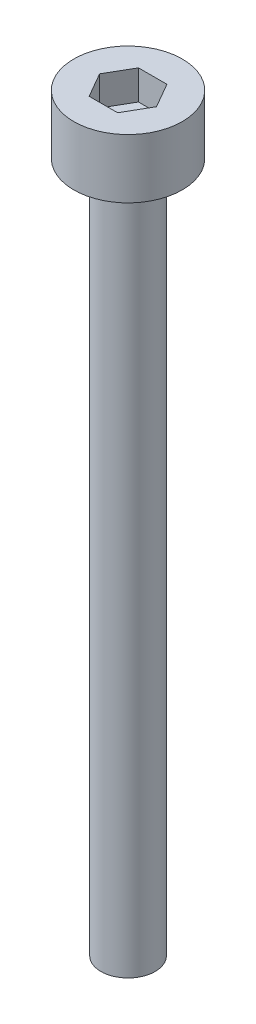
ISO-10303-21;
HEADER;
FILE_DESCRIPTION(('STEP AP214'),'2;1');
FILE_NAME('part.step','',(''),(''),'','','');
FILE_SCHEMA(('AUTOMOTIVE_DESIGN { 1 0 10303 214 1 1 1 1 }'));
ENDSEC;
DATA;
#1=APPLICATION_CONTEXT('core data for automotive mechanical design processes');
#2=APPLICATION_PROTOCOL_DEFINITION('international standard','automotive_design',2000,#1);
#3=PRODUCT_CONTEXT('',#1,'mechanical');
#4=PRODUCT('Part','Part','',(#3));
#5=PRODUCT_RELATED_PRODUCT_CATEGORY('part','',(#4));
#6=PRODUCT_DEFINITION_FORMATION('','',#4);
#7=PRODUCT_DEFINITION_CONTEXT('part definition',#1,'design');
#8=PRODUCT_DEFINITION('design','',#6,#7);
#9=PRODUCT_DEFINITION_SHAPE('','',#8);
#10=(LENGTH_UNIT() NAMED_UNIT(*) SI_UNIT(.MILLI.,.METRE.));
#11=(NAMED_UNIT(*) PLANE_ANGLE_UNIT() SI_UNIT($,.RADIAN.));
#12=(NAMED_UNIT(*) SI_UNIT($,.STERADIAN.) SOLID_ANGLE_UNIT());
#13=UNCERTAINTY_MEASURE_WITH_UNIT(LENGTH_MEASURE(1.E-05),#10,'distance_accuracy_value','');
#14=(GEOMETRIC_REPRESENTATION_CONTEXT(3) GLOBAL_UNCERTAINTY_ASSIGNED_CONTEXT((#13)) GLOBAL_UNIT_ASSIGNED_CONTEXT((#10,
#11,#12)) REPRESENTATION_CONTEXT('',''));
#15=CARTESIAN_POINT('',(0.,0.,0.));
#16=DIRECTION('',(0.,0.,1.));
#17=DIRECTION('',(1.,0.,0.));
#18=AXIS2_PLACEMENT_3D('',#15,#16,#17);
#19=CARTESIAN_POINT('',(0.,3.,0.));
#20=DIRECTION('',(0.,-1.,0.));
#21=DIRECTION('',(1.,0.,0.));
#22=AXIS2_PLACEMENT_3D('',#19,#20,#21);
#23=PLANE('',#22);
#24=DIRECTION('',(0.5,0.,-0.866025403784439));
#25=VECTOR('',#24,1.);
#26=CARTESIAN_POINT('',(0.721687836487029,3.,1.25));
#27=LINE('',#26,#25);
#28=CARTESIAN_POINT('',(0.721687836487029,3.,1.25));
#29=VERTEX_POINT('',#28);
#30=CARTESIAN_POINT('',(1.44337567297406,3.,0.));
#31=VERTEX_POINT('',#30);
#32=EDGE_CURVE('E121',#29,#31,#27,.T.);
#33=ORIENTED_EDGE('',*,*,#32,.F.);
#34=DIRECTION('',(1.,0.,0.));
#35=VECTOR('',#34,1.);
#36=CARTESIAN_POINT('',(-0.721687836487036,3.,1.25));
#37=LINE('',#36,#35);
#38=CARTESIAN_POINT('',(-0.721687836487036,3.,1.25));
#39=VERTEX_POINT('',#38);
#40=EDGE_CURVE('E47',#39,#29,#37,.T.);
#41=ORIENTED_EDGE('',*,*,#40,.F.);
#42=DIRECTION('',(0.5,0.,0.866025403784439));
#43=VECTOR('',#42,1.);
#44=CARTESIAN_POINT('',(-1.44337567297407,3.,0.));
#45=LINE('',#44,#43);
#46=CARTESIAN_POINT('',(-1.44337567297407,3.,0.));
#47=VERTEX_POINT('',#46);
#48=EDGE_CURVE('E130',#47,#39,#45,.T.);
#49=ORIENTED_EDGE('',*,*,#48,.F.);
#50=DIRECTION('',(-0.5,0.,0.866025403784439));
#51=VECTOR('',#50,1.);
#52=CARTESIAN_POINT('',(-0.721687836487036,3.,-1.25));
#53=LINE('',#52,#51);
#54=CARTESIAN_POINT('',(-0.721687836487036,3.,-1.25));
#55=VERTEX_POINT('',#54);
#56=EDGE_CURVE('E128',#55,#47,#53,.T.);
#57=ORIENTED_EDGE('',*,*,#56,.F.);
#58=DIRECTION('',(-1.,0.,0.));
#59=VECTOR('',#58,1.);
#60=CARTESIAN_POINT('',(0.721687836487028,3.,-1.25));
#61=LINE('',#60,#59);
#62=CARTESIAN_POINT('',(0.721687836487028,3.,-1.25));
#63=VERTEX_POINT('',#62);
#64=EDGE_CURVE('E95',#63,#55,#61,.T.);
#65=ORIENTED_EDGE('',*,*,#64,.F.);
#66=DIRECTION('',(-0.5,0.,-0.866025403784438));
#67=VECTOR('',#66,1.);
#68=CARTESIAN_POINT('',(1.44337567297406,3.,0.));
#69=LINE('',#68,#67);
#70=EDGE_CURVE('E124',#31,#63,#69,.T.);
#71=ORIENTED_EDGE('',*,*,#70,.F.);
#72=EDGE_LOOP('',(#33,#41,#49,#57,#65,#71));
#73=FACE_BOUND('',#72,.T.);
#74=CARTESIAN_POINT('',(0.,3.,0.));
#75=DIRECTION('',(0.,-1.,0.));
#76=DIRECTION('',(1.,0.,0.));
#77=AXIS2_PLACEMENT_3D('',#74,#75,#76);
#78=CIRCLE('',#77,2.74999999999999);
#79=CARTESIAN_POINT('',(2.74999999999999,3.,0.));
#80=VERTEX_POINT('',#79);
#81=EDGE_CURVE('E11',#80,#80,#78,.T.);
#82=ORIENTED_EDGE('',*,*,#81,.F.);
#83=EDGE_LOOP('',(#82));
#84=FACE_BOUND('',#83,.T.);
#85=ADVANCED_FACE('F33',(#73,#84),#23,.F.);
#86=CARTESIAN_POINT('',(0.,-35.,0.));
#87=DIRECTION('',(0.,-1.,0.));
#88=DIRECTION('',(1.,0.,0.));
#89=AXIS2_PLACEMENT_3D('',#86,#87,#88);
#90=CYLINDRICAL_SURFACE('',#89,2.74999999999999);
#91=CARTESIAN_POINT('',(0.,0.,0.));
#92=DIRECTION('',(0.,-1.,0.));
#93=DIRECTION('',(1.,0.,0.));
#94=AXIS2_PLACEMENT_3D('',#91,#92,#93);
#95=CIRCLE('',#94,2.75);
#96=CARTESIAN_POINT('',(2.74999999999999,0.,0.));
#97=VERTEX_POINT('',#96);
#98=EDGE_CURVE('E40',#97,#97,#95,.T.);
#99=ORIENTED_EDGE('',*,*,#98,.F.);
#100=EDGE_LOOP('',(#99));
#101=FACE_BOUND('',#100,.T.);
#102=ORIENTED_EDGE('',*,*,#81,.T.);
#103=EDGE_LOOP('',(#102));
#104=FACE_BOUND('',#103,.T.);
#105=ADVANCED_FACE('F149',(#101,#104),#90,.T.);
#106=CARTESIAN_POINT('',(-2.75,0.,0.));
#107=DIRECTION('',(0.,1.,0.));
#108=DIRECTION('',(-1.,0.,0.));
#109=AXIS2_PLACEMENT_3D('',#106,#107,#108);
#110=PLANE('',#109);
#111=CARTESIAN_POINT('',(0.,0.,0.));
#112=DIRECTION('',(0.,-1.,0.));
#113=DIRECTION('',(1.,0.,0.));
#114=AXIS2_PLACEMENT_3D('',#111,#112,#113);
#115=CIRCLE('',#114,1.375);
#116=CARTESIAN_POINT('',(1.37499999999999,0.,0.));
#117=VERTEX_POINT('',#116);
#118=EDGE_CURVE('E142',#117,#117,#115,.T.);
#119=ORIENTED_EDGE('',*,*,#118,.F.);
#120=EDGE_LOOP('',(#119));
#121=FACE_BOUND('',#120,.T.);
#122=ORIENTED_EDGE('',*,*,#98,.T.);
#123=EDGE_LOOP('',(#122));
#124=FACE_BOUND('',#123,.T.);
#125=ADVANCED_FACE('F147',(#121,#124),#110,.F.);
#126=CARTESIAN_POINT('',(0.,-35.,0.));
#127=DIRECTION('',(0.,-1.,0.));
#128=DIRECTION('',(1.,0.,0.));
#129=AXIS2_PLACEMENT_3D('',#126,#127,#128);
#130=CYLINDRICAL_SURFACE('',#129,1.375);
#131=CARTESIAN_POINT('',(0.,-35.,0.));
#132=DIRECTION('',(0.,-1.,0.));
#133=DIRECTION('',(1.,0.,0.));
#134=AXIS2_PLACEMENT_3D('',#131,#132,#133);
#135=CIRCLE('',#134,1.375);
#136=CARTESIAN_POINT('',(1.375,-35.,0.));
#137=VERTEX_POINT('',#136);
#138=EDGE_CURVE('E134',#137,#137,#135,.T.);
#139=ORIENTED_EDGE('',*,*,#138,.F.);
#140=EDGE_LOOP('',(#139));
#141=FACE_BOUND('',#140,.T.);
#142=ORIENTED_EDGE('',*,*,#118,.T.);
#143=EDGE_LOOP('',(#142));
#144=FACE_BOUND('',#143,.T.);
#145=ADVANCED_FACE('F174',(#141,#144),#130,.T.);
#146=CARTESIAN_POINT('',(-1.375,-35.,0.));
#147=DIRECTION('',(0.,1.,0.));
#148=DIRECTION('',(-1.,0.,0.));
#149=AXIS2_PLACEMENT_3D('',#146,#147,#148);
#150=PLANE('',#149);
#151=ORIENTED_EDGE('',*,*,#138,.T.);
#152=EDGE_LOOP('',(#151));
#153=FACE_BOUND('',#152,.T.);
#154=ADVANCED_FACE('F167',(#153),#150,.F.);
#155=CARTESIAN_POINT('',(-0.721687836487036,1.5,1.25));
#156=DIRECTION('',(0.,0.,1.));
#157=DIRECTION('',(1.,0.,0.));
#158=AXIS2_PLACEMENT_3D('',#155,#156,#157);
#159=PLANE('',#158);
#160=ORIENTED_EDGE('',*,*,#40,.T.);
#161=DIRECTION('',(0.,1.,0.));
#162=VECTOR('',#161,1.);
#163=CARTESIAN_POINT('',(0.721687836487029,1.5,1.25));
#164=LINE('',#163,#162);
#165=CARTESIAN_POINT('',(0.721687836487029,1.5,1.25));
#166=VERTEX_POINT('',#165);
#167=EDGE_CURVE('E77',#166,#29,#164,.T.);
#168=ORIENTED_EDGE('',*,*,#167,.F.);
#169=DIRECTION('',(1.,0.,0.));
#170=VECTOR('',#169,1.);
#171=CARTESIAN_POINT('',(-0.721687836487036,1.5,1.25));
#172=LINE('',#171,#170);
#173=CARTESIAN_POINT('',(-0.721687836487036,1.5,1.25));
#174=VERTEX_POINT('',#173);
#175=EDGE_CURVE('E132',#174,#166,#172,.T.);
#176=ORIENTED_EDGE('',*,*,#175,.F.);
#177=DIRECTION('',(0.,1.,0.));
#178=VECTOR('',#177,1.);
#179=CARTESIAN_POINT('',(-0.721687836487036,1.5,1.25));
#180=LINE('',#179,#178);
#181=EDGE_CURVE('E55',#174,#39,#180,.T.);
#182=ORIENTED_EDGE('',*,*,#181,.T.);
#183=EDGE_LOOP('',(#160,#168,#176,#182));
#184=FACE_BOUND('',#183,.T.);
#185=ADVANCED_FACE('F164',(#184),#159,.F.);
#186=CARTESIAN_POINT('',(-1.44337567297407,1.5,0.));
#187=DIRECTION('',(-0.866025403784438,0.,0.5));
#188=DIRECTION('',(0.5,0.,0.866025403784439));
#189=AXIS2_PLACEMENT_3D('',#186,#187,#188);
#190=PLANE('',#189);
#191=ORIENTED_EDGE('',*,*,#48,.T.);
#192=ORIENTED_EDGE('',*,*,#181,.F.);
#193=DIRECTION('',(0.5,0.,0.866025403784439));
#194=VECTOR('',#193,1.);
#195=CARTESIAN_POINT('',(-1.44337567297407,1.5,0.));
#196=LINE('',#195,#194);
#197=CARTESIAN_POINT('',(-1.44337567297407,1.5,0.));
#198=VERTEX_POINT('',#197);
#199=EDGE_CURVE('E107',#198,#174,#196,.T.);
#200=ORIENTED_EDGE('',*,*,#199,.F.);
#201=DIRECTION('',(0.,1.,0.));
#202=VECTOR('',#201,1.);
#203=CARTESIAN_POINT('',(-1.44337567297407,1.5,0.));
#204=LINE('',#203,#202);
#205=EDGE_CURVE('E99',#198,#47,#204,.T.);
#206=ORIENTED_EDGE('',*,*,#205,.T.);
#207=EDGE_LOOP('',(#191,#192,#200,#206));
#208=FACE_BOUND('',#207,.T.);
#209=ADVANCED_FACE('F166',(#208),#190,.F.);
#210=CARTESIAN_POINT('',(-0.721687836487036,1.5,-1.25));
#211=DIRECTION('',(-0.866025403784439,0.,-0.5));
#212=DIRECTION('',(-0.5,0.,0.866025403784439));
#213=AXIS2_PLACEMENT_3D('',#210,#211,#212);
#214=PLANE('',#213);
#215=ORIENTED_EDGE('',*,*,#56,.T.);
#216=ORIENTED_EDGE('',*,*,#205,.F.);
#217=DIRECTION('',(-0.5,0.,0.866025403784439));
#218=VECTOR('',#217,1.);
#219=CARTESIAN_POINT('',(-0.721687836487036,1.5,-1.25));
#220=LINE('',#219,#218);
#221=CARTESIAN_POINT('',(-0.721687836487036,1.5,-1.25));
#222=VERTEX_POINT('',#221);
#223=EDGE_CURVE('E103',#222,#198,#220,.T.);
#224=ORIENTED_EDGE('',*,*,#223,.F.);
#225=DIRECTION('',(0.,1.,0.));
#226=VECTOR('',#225,1.);
#227=CARTESIAN_POINT('',(-0.721687836487036,1.5,-1.25));
#228=LINE('',#227,#226);
#229=EDGE_CURVE('E88',#222,#55,#228,.T.);
#230=ORIENTED_EDGE('',*,*,#229,.T.);
#231=EDGE_LOOP('',(#215,#216,#224,#230));
#232=FACE_BOUND('',#231,.T.);
#233=ADVANCED_FACE('F104',(#232),#214,.F.);
#234=CARTESIAN_POINT('',(0.721687836487028,1.5,-1.25));
#235=DIRECTION('',(0.,0.,-1.));
#236=DIRECTION('',(-1.,0.,0.));
#237=AXIS2_PLACEMENT_3D('',#234,#235,#236);
#238=PLANE('',#237);
#239=ORIENTED_EDGE('',*,*,#64,.T.);
#240=ORIENTED_EDGE('',*,*,#229,.F.);
#241=DIRECTION('',(-1.,0.,0.));
#242=VECTOR('',#241,1.);
#243=CARTESIAN_POINT('',(0.721687836487028,1.5,-1.25));
#244=LINE('',#243,#242);
#245=CARTESIAN_POINT('',(0.721687836487028,1.5,-1.25));
#246=VERTEX_POINT('',#245);
#247=EDGE_CURVE('E92',#246,#222,#244,.T.);
#248=ORIENTED_EDGE('',*,*,#247,.F.);
#249=DIRECTION('',(0.,1.,0.));
#250=VECTOR('',#249,1.);
#251=CARTESIAN_POINT('',(0.721687836487028,1.5,-1.25));
#252=LINE('',#251,#250);
#253=EDGE_CURVE('E100',#246,#63,#252,.T.);
#254=ORIENTED_EDGE('',*,*,#253,.T.);
#255=EDGE_LOOP('',(#239,#240,#248,#254));
#256=FACE_BOUND('',#255,.T.);
#257=ADVANCED_FACE('F90',(#256),#238,.F.);
#258=CARTESIAN_POINT('',(1.44337567297406,1.5,0.));
#259=DIRECTION('',(0.866025403784439,0.,-0.5));
#260=DIRECTION('',(-0.5,0.,-0.866025403784439));
#261=AXIS2_PLACEMENT_3D('',#258,#259,#260);
#262=PLANE('',#261);
#263=ORIENTED_EDGE('',*,*,#70,.T.);
#264=ORIENTED_EDGE('',*,*,#253,.F.);
#265=DIRECTION('',(-0.5,0.,-0.866025403784438));
#266=VECTOR('',#265,1.);
#267=CARTESIAN_POINT('',(1.44337567297406,1.5,0.));
#268=LINE('',#267,#266);
#269=CARTESIAN_POINT('',(1.44337567297406,1.5,0.));
#270=VERTEX_POINT('',#269);
#271=EDGE_CURVE('E113',#270,#246,#268,.T.);
#272=ORIENTED_EDGE('',*,*,#271,.F.);
#273=DIRECTION('',(0.,1.,0.));
#274=VECTOR('',#273,1.);
#275=CARTESIAN_POINT('',(1.44337567297406,1.5,0.));
#276=LINE('',#275,#274);
#277=EDGE_CURVE('E137',#270,#31,#276,.T.);
#278=ORIENTED_EDGE('',*,*,#277,.T.);
#279=EDGE_LOOP('',(#263,#264,#272,#278));
#280=FACE_BOUND('',#279,.T.);
#281=ADVANCED_FACE('F231',(#280),#262,.F.);
#282=CARTESIAN_POINT('',(0.721687836487029,1.5,1.25));
#283=DIRECTION('',(0.866025403784439,0.,0.5));
#284=DIRECTION('',(0.5,0.,-0.866025403784439));
#285=AXIS2_PLACEMENT_3D('',#282,#283,#284);
#286=PLANE('',#285);
#287=ORIENTED_EDGE('',*,*,#32,.T.);
#288=ORIENTED_EDGE('',*,*,#277,.F.);
#289=DIRECTION('',(0.5,0.,-0.866025403784439));
#290=VECTOR('',#289,1.);
#291=CARTESIAN_POINT('',(0.721687836487029,1.5,1.25));
#292=LINE('',#291,#290);
#293=EDGE_CURVE('E115',#166,#270,#292,.T.);
#294=ORIENTED_EDGE('',*,*,#293,.F.);
#295=ORIENTED_EDGE('',*,*,#167,.T.);
#296=EDGE_LOOP('',(#287,#288,#294,#295));
#297=FACE_BOUND('',#296,.T.);
#298=ADVANCED_FACE('F162',(#297),#286,.F.);
#299=CARTESIAN_POINT('',(0.,1.5,0.));
#300=DIRECTION('',(0.,1.,0.));
#301=DIRECTION('',(0.,0.,1.));
#302=AXIS2_PLACEMENT_3D('',#299,#300,#301);
#303=PLANE('',#302);
#304=ORIENTED_EDGE('',*,*,#175,.T.);
#305=ORIENTED_EDGE('',*,*,#293,.T.);
#306=ORIENTED_EDGE('',*,*,#271,.T.);
#307=ORIENTED_EDGE('',*,*,#247,.T.);
#308=ORIENTED_EDGE('',*,*,#223,.T.);
#309=ORIENTED_EDGE('',*,*,#199,.T.);
#310=EDGE_LOOP('',(#304,#305,#306,#307,#308,#309));
#311=FACE_BOUND('',#310,.T.);
#312=ADVANCED_FACE('F110',(#311),#303,.T.);
#313=CLOSED_SHELL('',(#85,#105,#125,#145,#154,#185,#209,#233,#257,#281,#298,#312));
#314=MANIFOLD_SOLID_BREP('B2',#313);
#315=ADVANCED_BREP_SHAPE_REPRESENTATION('',(#18,#314),#14);
#316=SHAPE_DEFINITION_REPRESENTATION(#9,#315);
ENDSEC;
END-ISO-10303-21;
